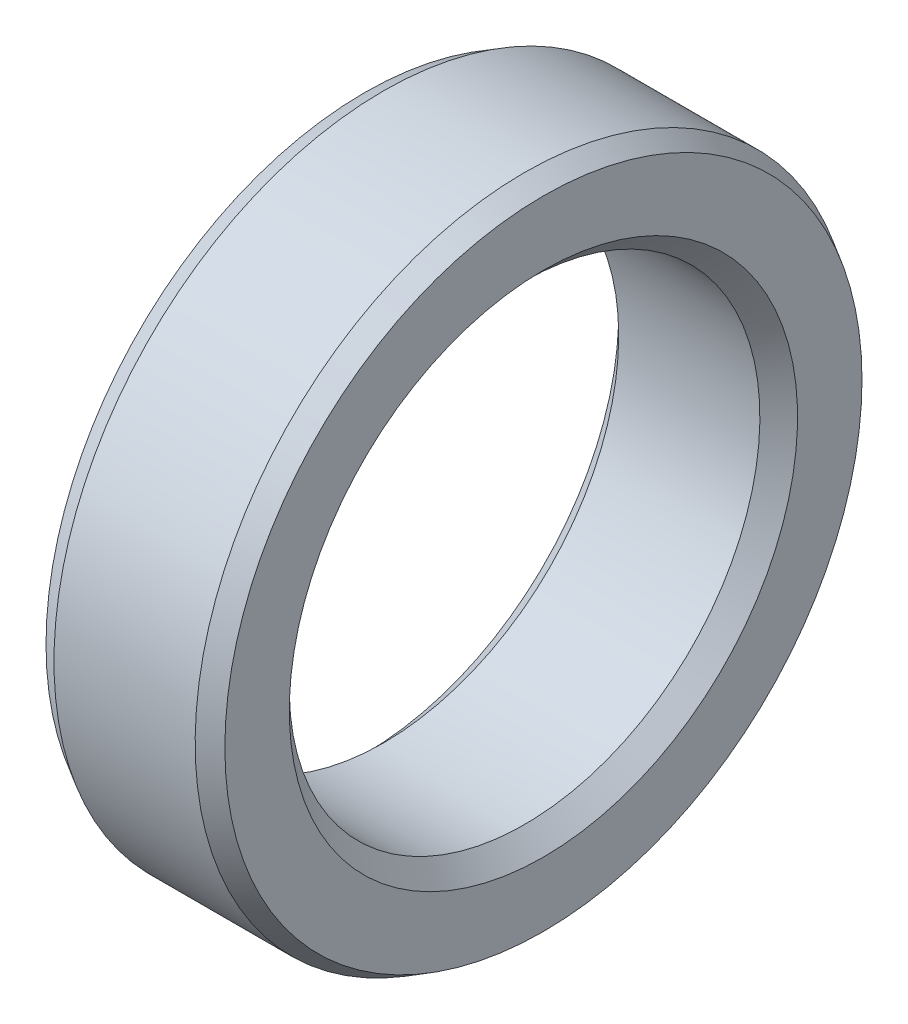
ISO-10303-21;
HEADER;
FILE_DESCRIPTION(('STEP AP214'),'2;1');
FILE_NAME('part.step','',(''),(''),'','','');
FILE_SCHEMA(('AUTOMOTIVE_DESIGN { 1 0 10303 214 1 1 1 1 }'));
ENDSEC;
DATA;
#1=APPLICATION_CONTEXT('core data for automotive mechanical design processes');
#2=APPLICATION_PROTOCOL_DEFINITION('international standard','automotive_design',2000,#1);
#3=PRODUCT_CONTEXT('',#1,'mechanical');
#4=PRODUCT('Part','Part','',(#3));
#5=PRODUCT_RELATED_PRODUCT_CATEGORY('part','',(#4));
#6=PRODUCT_DEFINITION_FORMATION('','',#4);
#7=PRODUCT_DEFINITION_CONTEXT('part definition',#1,'design');
#8=PRODUCT_DEFINITION('design','',#6,#7);
#9=PRODUCT_DEFINITION_SHAPE('','',#8);
#10=(LENGTH_UNIT() NAMED_UNIT(*) SI_UNIT(.MILLI.,.METRE.));
#11=(NAMED_UNIT(*) PLANE_ANGLE_UNIT() SI_UNIT($,.RADIAN.));
#12=(NAMED_UNIT(*) SI_UNIT($,.STERADIAN.) SOLID_ANGLE_UNIT());
#13=UNCERTAINTY_MEASURE_WITH_UNIT(LENGTH_MEASURE(1.E-05),#10,'distance_accuracy_value','');
#14=(GEOMETRIC_REPRESENTATION_CONTEXT(3) GLOBAL_UNCERTAINTY_ASSIGNED_CONTEXT((#13)) GLOBAL_UNIT_ASSIGNED_CONTEXT((#10,
#11,#12)) REPRESENTATION_CONTEXT('',''));
#15=CARTESIAN_POINT('',(0.,0.,0.));
#16=DIRECTION('',(0.,0.,1.));
#17=DIRECTION('',(1.,0.,0.));
#18=AXIS2_PLACEMENT_3D('',#15,#16,#17);
#19=CARTESIAN_POINT('',(-123.202064281287,17.5,0.));
#20=DIRECTION('',(1.,0.,0.));
#21=DIRECTION('',(0.,1.,0.));
#22=AXIS2_PLACEMENT_3D('',#19,#20,#21);
#23=PLANE('',#22);
#24=CARTESIAN_POINT('',(-123.202064281287,0.,0.));
#25=DIRECTION('',(1.,0.,0.));
#26=DIRECTION('',(0.,1.,0.));
#27=AXIS2_PLACEMENT_3D('',#24,#25,#26);
#28=CIRCLE('',#27,16.9226497308104);
#29=CARTESIAN_POINT('',(-123.202064281287,16.9226497308104,0.));
#30=VERTEX_POINT('',#29);
#31=EDGE_CURVE('E45',#30,#30,#28,.T.);
#32=ORIENTED_EDGE('',*,*,#31,.T.);
#33=EDGE_LOOP('',(#32));
#34=FACE_BOUND('',#33,.T.);
#35=CARTESIAN_POINT('',(-123.202064281287,0.,0.));
#36=DIRECTION('',(1.,0.,0.));
#37=DIRECTION('',(0.,1.,0.));
#38=AXIS2_PLACEMENT_3D('',#35,#36,#37);
#39=CIRCLE('',#38,13.5);
#40=CARTESIAN_POINT('',(-123.202064281287,13.5,0.));
#41=VERTEX_POINT('',#40);
#42=EDGE_CURVE('E50',#41,#41,#39,.F.);
#43=ORIENTED_EDGE('',*,*,#42,.T.);
#44=EDGE_LOOP('',(#43));
#45=FACE_BOUND('',#44,.T.);
#46=ADVANCED_FACE('F31',(#34,#45),#23,.T.);
#47=CARTESIAN_POINT('',(-114.464475961906,0.,0.));
#48=DIRECTION('',(1.,0.,0.));
#49=DIRECTION('',(0.,1.,0.));
#50=AXIS2_PLACEMENT_3D('',#47,#48,#49);
#51=CYLINDRICAL_SURFACE('',#50,17.5);
#52=CARTESIAN_POINT('',(-124.202064281287,0.,0.));
#53=DIRECTION('',(1.,0.,0.));
#54=DIRECTION('',(0.,1.,0.));
#55=AXIS2_PLACEMENT_3D('',#52,#53,#54);
#56=CIRCLE('',#55,17.5);
#57=CARTESIAN_POINT('',(-124.202064281287,17.5,0.));
#58=VERTEX_POINT('',#57);
#59=EDGE_CURVE('E37',#58,#58,#56,.F.);
#60=ORIENTED_EDGE('',*,*,#59,.T.);
#61=EDGE_LOOP('',(#60));
#62=FACE_BOUND('',#61,.T.);
#63=CARTESIAN_POINT('',(-131.702064281287,0.,0.));
#64=DIRECTION('',(-1.,0.,0.));
#65=DIRECTION('',(0.,-1.,0.));
#66=AXIS2_PLACEMENT_3D('',#63,#64,#65);
#67=CIRCLE('',#66,17.5);
#68=CARTESIAN_POINT('',(-131.702064281287,-17.5,0.));
#69=VERTEX_POINT('',#68);
#70=EDGE_CURVE('E41',#69,#69,#67,.F.);
#71=ORIENTED_EDGE('',*,*,#70,.T.);
#72=EDGE_LOOP('',(#71));
#73=FACE_BOUND('',#72,.T.);
#74=ADVANCED_FACE('F82',(#62,#73),#51,.T.);
#75=CARTESIAN_POINT('',(-132.702064281287,12.5,0.));
#76=DIRECTION('',(-1.,0.,0.));
#77=DIRECTION('',(0.,-1.,0.));
#78=AXIS2_PLACEMENT_3D('',#75,#76,#77);
#79=PLANE('',#78);
#80=CARTESIAN_POINT('',(-132.702064281287,0.,0.));
#81=DIRECTION('',(-1.,0.,0.));
#82=DIRECTION('',(0.,-1.,0.));
#83=AXIS2_PLACEMENT_3D('',#80,#81,#82);
#84=CIRCLE('',#83,16.9226497308104);
#85=CARTESIAN_POINT('',(-132.702064281287,-16.9226497308103,0.));
#86=VERTEX_POINT('',#85);
#87=EDGE_CURVE('E10',#86,#86,#84,.T.);
#88=ORIENTED_EDGE('',*,*,#87,.T.);
#89=EDGE_LOOP('',(#88));
#90=FACE_BOUND('',#89,.T.);
#91=CARTESIAN_POINT('',(-132.702064281287,0.,0.));
#92=DIRECTION('',(-1.,0.,0.));
#93=DIRECTION('',(0.,-1.,0.));
#94=AXIS2_PLACEMENT_3D('',#91,#92,#93);
#95=CIRCLE('',#94,13.5);
#96=CARTESIAN_POINT('',(-132.702064281287,-13.5,0.));
#97=VERTEX_POINT('',#96);
#98=EDGE_CURVE('E59',#97,#97,#95,.F.);
#99=ORIENTED_EDGE('',*,*,#98,.T.);
#100=EDGE_LOOP('',(#99));
#101=FACE_BOUND('',#100,.T.);
#102=ADVANCED_FACE('F63',(#90,#101),#79,.T.);
#103=CARTESIAN_POINT('',(-114.464475961906,0.,0.));
#104=DIRECTION('',(1.,0.,0.));
#105=DIRECTION('',(0.,1.,0.));
#106=AXIS2_PLACEMENT_3D('',#103,#104,#105);
#107=CYLINDRICAL_SURFACE('',#106,12.5);
#108=CARTESIAN_POINT('',(-131.702064281287,0.,0.));
#109=DIRECTION('',(-1.,0.,0.));
#110=DIRECTION('',(0.,-1.,0.));
#111=AXIS2_PLACEMENT_3D('',#108,#109,#110);
#112=CIRCLE('',#111,12.5);
#113=CARTESIAN_POINT('',(-131.702064281287,-12.5,0.));
#114=VERTEX_POINT('',#113);
#115=EDGE_CURVE('E53',#114,#114,#112,.T.);
#116=ORIENTED_EDGE('',*,*,#115,.T.);
#117=EDGE_LOOP('',(#116));
#118=FACE_BOUND('',#117,.T.);
#119=CARTESIAN_POINT('',(-124.202064281287,0.,0.));
#120=DIRECTION('',(1.,0.,0.));
#121=DIRECTION('',(0.,1.,0.));
#122=AXIS2_PLACEMENT_3D('',#119,#120,#121);
#123=CIRCLE('',#122,12.5);
#124=CARTESIAN_POINT('',(-124.202064281287,12.5,0.));
#125=VERTEX_POINT('',#124);
#126=EDGE_CURVE('E56',#125,#125,#123,.T.);
#127=ORIENTED_EDGE('',*,*,#126,.T.);
#128=EDGE_LOOP('',(#127));
#129=FACE_BOUND('',#128,.T.);
#130=ADVANCED_FACE('F68',(#118,#129),#107,.F.);
#131=CARTESIAN_POINT('',(-132.702064281287,0.,0.));
#132=DIRECTION('',(-1.,0.,0.));
#133=DIRECTION('',(0.,-1.,0.));
#134=AXIS2_PLACEMENT_3D('',#131,#132,#133);
#135=CONICAL_SURFACE('',#134,13.5,0.785398163397457);
#136=ORIENTED_EDGE('',*,*,#115,.F.);
#137=EDGE_LOOP('',(#136));
#138=FACE_BOUND('',#137,.T.);
#139=ORIENTED_EDGE('',*,*,#98,.F.);
#140=EDGE_LOOP('',(#139));
#141=FACE_BOUND('',#140,.T.);
#142=ADVANCED_FACE('F65',(#138,#141),#135,.F.);
#143=CARTESIAN_POINT('',(-124.202064281287,0.,0.));
#144=DIRECTION('',(1.,0.,0.));
#145=DIRECTION('',(0.,1.,0.));
#146=AXIS2_PLACEMENT_3D('',#143,#144,#145);
#147=CONICAL_SURFACE('',#146,12.5,0.785398163397445);
#148=ORIENTED_EDGE('',*,*,#42,.F.);
#149=EDGE_LOOP('',(#148));
#150=FACE_BOUND('',#149,.T.);
#151=ORIENTED_EDGE('',*,*,#126,.F.);
#152=EDGE_LOOP('',(#151));
#153=FACE_BOUND('',#152,.T.);
#154=ADVANCED_FACE('F67',(#150,#153),#147,.F.);
#155=CARTESIAN_POINT('',(-123.202064281287,0.,0.));
#156=DIRECTION('',(-1.,0.,0.));
#157=DIRECTION('',(0.,-1.,0.));
#158=AXIS2_PLACEMENT_3D('',#155,#156,#157);
#159=CONICAL_SURFACE('',#158,16.9226497308104,0.523598775598307);
#160=ORIENTED_EDGE('',*,*,#59,.F.);
#161=EDGE_LOOP('',(#160));
#162=FACE_BOUND('',#161,.T.);
#163=ORIENTED_EDGE('',*,*,#31,.F.);
#164=EDGE_LOOP('',(#163));
#165=FACE_BOUND('',#164,.T.);
#166=ADVANCED_FACE('F75',(#162,#165),#159,.T.);
#167=CARTESIAN_POINT('',(-131.702064281287,0.,0.));
#168=DIRECTION('',(1.,0.,0.));
#169=DIRECTION('',(0.,1.,0.));
#170=AXIS2_PLACEMENT_3D('',#167,#168,#169);
#171=CONICAL_SURFACE('',#170,17.5,0.523598775598307);
#172=ORIENTED_EDGE('',*,*,#87,.F.);
#173=EDGE_LOOP('',(#172));
#174=FACE_BOUND('',#173,.T.);
#175=ORIENTED_EDGE('',*,*,#70,.F.);
#176=EDGE_LOOP('',(#175));
#177=FACE_BOUND('',#176,.T.);
#178=ADVANCED_FACE('F95',(#174,#177),#171,.T.);
#179=CLOSED_SHELL('',(#46,#74,#102,#130,#142,#154,#166,#178));
#180=MANIFOLD_SOLID_BREP('B2',#179);
#181=ADVANCED_BREP_SHAPE_REPRESENTATION('',(#18,#180),#14);
#182=SHAPE_DEFINITION_REPRESENTATION(#9,#181);
ENDSEC;
END-ISO-10303-21;
